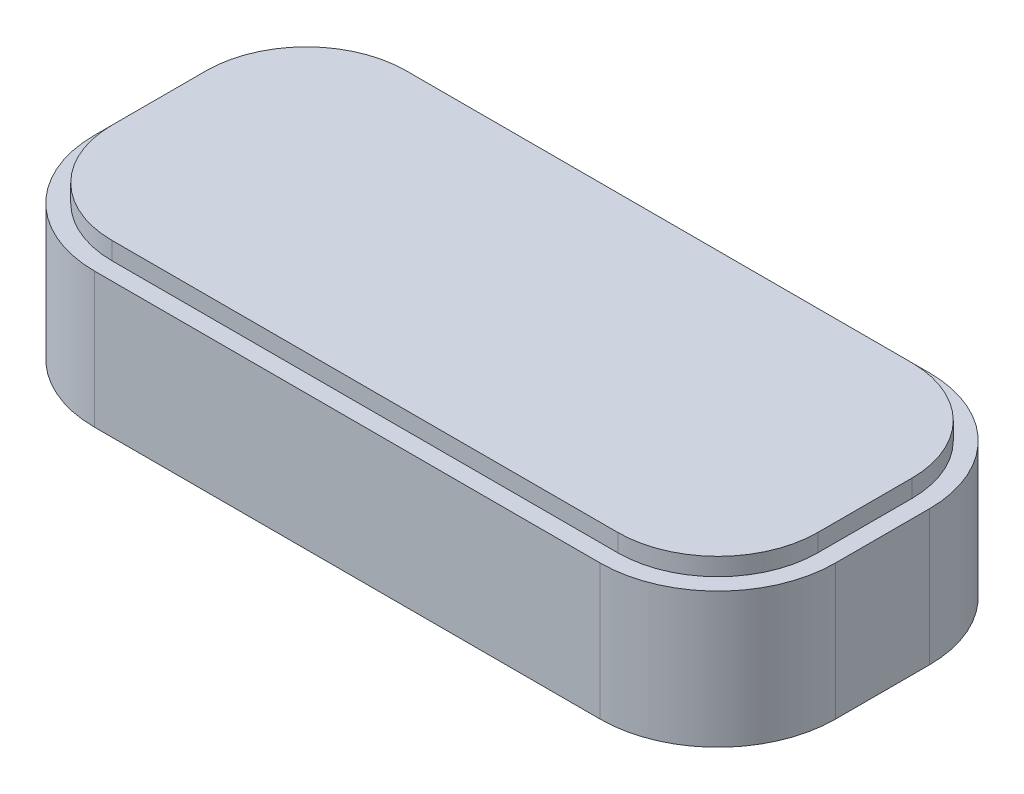
ISO-10303-21;
HEADER;
FILE_DESCRIPTION(('STEP AP214'),'2;1');
FILE_NAME('part.step','',(''),(''),'','','');
FILE_SCHEMA(('AUTOMOTIVE_DESIGN { 1 0 10303 214 1 1 1 1 }'));
ENDSEC;
DATA;
#1=APPLICATION_CONTEXT('core data for automotive mechanical design processes');
#2=APPLICATION_PROTOCOL_DEFINITION('international standard','automotive_design',2000,#1);
#3=PRODUCT_CONTEXT('',#1,'mechanical');
#4=PRODUCT('Part','Part','',(#3));
#5=PRODUCT_RELATED_PRODUCT_CATEGORY('part','',(#4));
#6=PRODUCT_DEFINITION_FORMATION('','',#4);
#7=PRODUCT_DEFINITION_CONTEXT('part definition',#1,'design');
#8=PRODUCT_DEFINITION('design','',#6,#7);
#9=PRODUCT_DEFINITION_SHAPE('','',#8);
#10=(LENGTH_UNIT() NAMED_UNIT(*) SI_UNIT(.MILLI.,.METRE.));
#11=(NAMED_UNIT(*) PLANE_ANGLE_UNIT() SI_UNIT($,.RADIAN.));
#12=(NAMED_UNIT(*) SI_UNIT($,.STERADIAN.) SOLID_ANGLE_UNIT());
#13=UNCERTAINTY_MEASURE_WITH_UNIT(LENGTH_MEASURE(1.E-05),#10,'distance_accuracy_value','');
#14=(GEOMETRIC_REPRESENTATION_CONTEXT(3) GLOBAL_UNCERTAINTY_ASSIGNED_CONTEXT((#13)) GLOBAL_UNIT_ASSIGNED_CONTEXT((#10,
#11,#12)) REPRESENTATION_CONTEXT('',''));
#15=CARTESIAN_POINT('',(0.,0.,0.));
#16=DIRECTION('',(0.,0.,1.));
#17=DIRECTION('',(1.,0.,0.));
#18=AXIS2_PLACEMENT_3D('',#15,#16,#17);
#19=CARTESIAN_POINT('',(-1.0922,0.5842,-0.2032));
#20=DIRECTION('',(0.,-1.,0.));
#21=DIRECTION('',(0.,0.,-1.));
#22=AXIS2_PLACEMENT_3D('',#19,#20,#21);
#23=PLANE('',#22);
#24=CARTESIAN_POINT('',(-1.0922,0.5842,-0.2032));
#25=DIRECTION('',(0.,1.,0.));
#26=DIRECTION('',(0.,0.,-1.));
#27=AXIS2_PLACEMENT_3D('',#24,#25,#26);
#28=CIRCLE('',#27,0.508);
#29=CARTESIAN_POINT('',(-1.0922,0.5842,-0.7112));
#30=VERTEX_POINT('',#29);
#31=CARTESIAN_POINT('',(-1.6002,0.5842,-0.2032));
#32=VERTEX_POINT('',#31);
#33=EDGE_CURVE('E175',#30,#32,#28,.T.);
#34=ORIENTED_EDGE('',*,*,#33,.T.);
#35=DIRECTION('',(0.,0.,1.));
#36=VECTOR('',#35,1.);
#37=CARTESIAN_POINT('',(-1.6002,0.5842,-0.2032));
#38=LINE('',#37,#36);
#39=CARTESIAN_POINT('',(-1.6002,0.5842,0.2032));
#40=VERTEX_POINT('',#39);
#41=EDGE_CURVE('E178',#32,#40,#38,.T.);
#42=ORIENTED_EDGE('',*,*,#41,.T.);
#43=CARTESIAN_POINT('',(-1.0922,0.5842,0.2032));
#44=DIRECTION('',(0.,1.,0.));
#45=DIRECTION('',(0.,0.,1.));
#46=AXIS2_PLACEMENT_3D('',#43,#44,#45);
#47=CIRCLE('',#46,0.508);
#48=CARTESIAN_POINT('',(-1.0922,0.5842,0.7112));
#49=VERTEX_POINT('',#48);
#50=EDGE_CURVE('E181',#40,#49,#47,.T.);
#51=ORIENTED_EDGE('',*,*,#50,.T.);
#52=DIRECTION('',(1.,0.,0.));
#53=VECTOR('',#52,1.);
#54=CARTESIAN_POINT('',(-1.0922,0.5842,0.7112));
#55=LINE('',#54,#53);
#56=CARTESIAN_POINT('',(1.0922,0.5842,0.7112));
#57=VERTEX_POINT('',#56);
#58=EDGE_CURVE('E183',#49,#57,#55,.T.);
#59=ORIENTED_EDGE('',*,*,#58,.T.);
#60=CARTESIAN_POINT('',(1.0922,0.5842,0.2032));
#61=DIRECTION('',(0.,1.,0.));
#62=DIRECTION('',(0.,0.,1.));
#63=AXIS2_PLACEMENT_3D('',#60,#61,#62);
#64=CIRCLE('',#63,0.508);
#65=CARTESIAN_POINT('',(1.6002,0.5842,0.2032));
#66=VERTEX_POINT('',#65);
#67=EDGE_CURVE('E185',#57,#66,#64,.T.);
#68=ORIENTED_EDGE('',*,*,#67,.T.);
#69=DIRECTION('',(0.,0.,-1.));
#70=VECTOR('',#69,1.);
#71=CARTESIAN_POINT('',(1.6002,0.5842,0.2032));
#72=LINE('',#71,#70);
#73=CARTESIAN_POINT('',(1.6002,0.5842,-0.2032));
#74=VERTEX_POINT('',#73);
#75=EDGE_CURVE('E187',#66,#74,#72,.T.);
#76=ORIENTED_EDGE('',*,*,#75,.T.);
#77=CARTESIAN_POINT('',(1.0922,0.5842,-0.2032));
#78=DIRECTION('',(0.,1.,0.));
#79=DIRECTION('',(0.,0.,1.));
#80=AXIS2_PLACEMENT_3D('',#77,#78,#79);
#81=CIRCLE('',#80,0.508);
#82=CARTESIAN_POINT('',(1.0922,0.5842,-0.7112));
#83=VERTEX_POINT('',#82);
#84=EDGE_CURVE('E189',#74,#83,#81,.T.);
#85=ORIENTED_EDGE('',*,*,#84,.T.);
#86=DIRECTION('',(-1.,0.,0.));
#87=VECTOR('',#86,1.);
#88=CARTESIAN_POINT('',(-1.0922,0.5842,-0.7112));
#89=LINE('',#88,#87);
#90=EDGE_CURVE('E191',#83,#30,#89,.T.);
#91=ORIENTED_EDGE('',*,*,#90,.T.);
#92=EDGE_LOOP('',(#34,#42,#51,#59,#68,#76,#85,#91));
#93=FACE_BOUND('',#92,.T.);
#94=CARTESIAN_POINT('',(-1.0922,0.5842,-0.2032));
#95=DIRECTION('',(0.,1.,0.));
#96=DIRECTION('',(0.,0.,-1.));
#97=AXIS2_PLACEMENT_3D('',#94,#95,#96);
#98=CIRCLE('',#97,0.4318);
#99=CARTESIAN_POINT('',(-1.0922,0.5842,-0.635));
#100=VERTEX_POINT('',#99);
#101=CARTESIAN_POINT('',(-1.524,0.5842,-0.2032));
#102=VERTEX_POINT('',#101);
#103=EDGE_CURVE('E165',#100,#102,#98,.T.);
#104=ORIENTED_EDGE('',*,*,#103,.F.);
#105=DIRECTION('',(-1.,0.,0.));
#106=VECTOR('',#105,1.);
#107=CARTESIAN_POINT('',(1.0922,0.5842,-0.635));
#108=LINE('',#107,#106);
#109=CARTESIAN_POINT('',(1.0922,0.5842,-0.635));
#110=VERTEX_POINT('',#109);
#111=EDGE_CURVE('E162',#110,#100,#108,.T.);
#112=ORIENTED_EDGE('',*,*,#111,.F.);
#113=CARTESIAN_POINT('',(1.0922,0.5842,-0.2032));
#114=DIRECTION('',(0.,1.,0.));
#115=DIRECTION('',(0.,0.,1.));
#116=AXIS2_PLACEMENT_3D('',#113,#114,#115);
#117=CIRCLE('',#116,0.4318);
#118=CARTESIAN_POINT('',(1.524,0.5842,-0.2032));
#119=VERTEX_POINT('',#118);
#120=EDGE_CURVE('E431',#119,#110,#117,.T.);
#121=ORIENTED_EDGE('',*,*,#120,.F.);
#122=DIRECTION('',(0.,0.,-1.));
#123=VECTOR('',#122,1.);
#124=CARTESIAN_POINT('',(1.524,0.5842,0.2032));
#125=LINE('',#124,#123);
#126=CARTESIAN_POINT('',(1.524,0.5842,0.2032));
#127=VERTEX_POINT('',#126);
#128=EDGE_CURVE('E462',#127,#119,#125,.T.);
#129=ORIENTED_EDGE('',*,*,#128,.F.);
#130=CARTESIAN_POINT('',(1.0922,0.5842,0.2032));
#131=DIRECTION('',(0.,1.,0.));
#132=DIRECTION('',(0.,0.,1.));
#133=AXIS2_PLACEMENT_3D('',#130,#131,#132);
#134=CIRCLE('',#133,0.4318);
#135=CARTESIAN_POINT('',(1.0922,0.5842,0.635));
#136=VERTEX_POINT('',#135);
#137=EDGE_CURVE('E455',#136,#127,#134,.T.);
#138=ORIENTED_EDGE('',*,*,#137,.F.);
#139=DIRECTION('',(1.,0.,0.));
#140=VECTOR('',#139,1.);
#141=CARTESIAN_POINT('',(-1.0922,0.5842,0.635));
#142=LINE('',#141,#140);
#143=CARTESIAN_POINT('',(-1.0922,0.5842,0.635));
#144=VERTEX_POINT('',#143);
#145=EDGE_CURVE('E452',#144,#136,#142,.T.);
#146=ORIENTED_EDGE('',*,*,#145,.F.);
#147=CARTESIAN_POINT('',(-1.0922,0.5842,0.2032));
#148=DIRECTION('',(0.,1.,0.));
#149=DIRECTION('',(0.,0.,1.));
#150=AXIS2_PLACEMENT_3D('',#147,#148,#149);
#151=CIRCLE('',#150,0.4318);
#152=CARTESIAN_POINT('',(-1.524,0.5842,0.2032));
#153=VERTEX_POINT('',#152);
#154=EDGE_CURVE('E52',#153,#144,#151,.T.);
#155=ORIENTED_EDGE('',*,*,#154,.F.);
#156=DIRECTION('',(0.,0.,1.));
#157=VECTOR('',#156,1.);
#158=CARTESIAN_POINT('',(-1.524,0.5842,-0.2032));
#159=LINE('',#158,#157);
#160=EDGE_CURVE('E47',#102,#153,#159,.T.);
#161=ORIENTED_EDGE('',*,*,#160,.F.);
#162=EDGE_LOOP('',(#104,#112,#121,#129,#138,#146,#155,#161));
#163=FACE_BOUND('',#162,.T.);
#164=ADVANCED_FACE('F32',(#93,#163),#23,.F.);
#165=CARTESIAN_POINT('',(-1.0922,0.5842,-0.2032));
#166=DIRECTION('',(0.,-1.,0.));
#167=DIRECTION('',(0.,0.,-1.));
#168=AXIS2_PLACEMENT_3D('',#165,#166,#167);
#169=CYLINDRICAL_SURFACE('',#168,0.508);
#170=CARTESIAN_POINT('',(-1.0922,0.,-0.2032));
#171=DIRECTION('',(0.,1.,0.));
#172=DIRECTION('',(0.,0.,-1.));
#173=AXIS2_PLACEMENT_3D('',#170,#171,#172);
#174=CIRCLE('',#173,0.508);
#175=CARTESIAN_POINT('',(-1.0922,0.,-0.7112));
#176=VERTEX_POINT('',#175);
#177=CARTESIAN_POINT('',(-1.6002,0.,-0.2032));
#178=VERTEX_POINT('',#177);
#179=EDGE_CURVE('E166',#176,#178,#174,.T.);
#180=ORIENTED_EDGE('',*,*,#179,.T.);
#181=DIRECTION('',(0.,-1.,0.));
#182=VECTOR('',#181,1.);
#183=CARTESIAN_POINT('',(-1.6002,0.5842,-0.2032));
#184=LINE('',#183,#182);
#185=EDGE_CURVE('E11',#32,#178,#184,.T.);
#186=ORIENTED_EDGE('',*,*,#185,.F.);
#187=ORIENTED_EDGE('',*,*,#33,.F.);
#188=DIRECTION('',(0.,-1.,0.));
#189=VECTOR('',#188,1.);
#190=CARTESIAN_POINT('',(-1.0922,0.5842,-0.7112));
#191=LINE('',#190,#189);
#192=EDGE_CURVE('E192',#30,#176,#191,.T.);
#193=ORIENTED_EDGE('',*,*,#192,.T.);
#194=EDGE_LOOP('',(#180,#186,#187,#193));
#195=FACE_BOUND('',#194,.T.);
#196=ADVANCED_FACE('F34',(#195),#169,.T.);
#197=CARTESIAN_POINT('',(-1.6002,0.5842,-0.2032));
#198=DIRECTION('',(1.,0.,0.));
#199=DIRECTION('',(0.,0.,-1.));
#200=AXIS2_PLACEMENT_3D('',#197,#198,#199);
#201=PLANE('',#200);
#202=DIRECTION('',(0.,0.,1.));
#203=VECTOR('',#202,1.);
#204=CARTESIAN_POINT('',(-1.6002,0.,-0.2032));
#205=LINE('',#204,#203);
#206=CARTESIAN_POINT('',(-1.6002,0.,0.2032));
#207=VERTEX_POINT('',#206);
#208=EDGE_CURVE('E169',#178,#207,#205,.T.);
#209=ORIENTED_EDGE('',*,*,#208,.T.);
#210=DIRECTION('',(0.,-1.,0.));
#211=VECTOR('',#210,1.);
#212=CARTESIAN_POINT('',(-1.6002,0.5842,0.2032));
#213=LINE('',#212,#211);
#214=EDGE_CURVE('E40',#40,#207,#213,.T.);
#215=ORIENTED_EDGE('',*,*,#214,.F.);
#216=ORIENTED_EDGE('',*,*,#41,.F.);
#217=ORIENTED_EDGE('',*,*,#185,.T.);
#218=EDGE_LOOP('',(#209,#215,#216,#217));
#219=FACE_BOUND('',#218,.T.);
#220=ADVANCED_FACE('F249',(#219),#201,.F.);
#221=CARTESIAN_POINT('',(-1.0922,0.5842,0.2032));
#222=DIRECTION('',(0.,-1.,0.));
#223=DIRECTION('',(0.,0.,-1.));
#224=AXIS2_PLACEMENT_3D('',#221,#222,#223);
#225=CYLINDRICAL_SURFACE('',#224,0.508);
#226=CARTESIAN_POINT('',(-1.0922,0.,0.2032));
#227=DIRECTION('',(0.,1.,0.));
#228=DIRECTION('',(0.,0.,1.));
#229=AXIS2_PLACEMENT_3D('',#226,#227,#228);
#230=CIRCLE('',#229,0.508);
#231=CARTESIAN_POINT('',(-1.0922,0.,0.7112));
#232=VERTEX_POINT('',#231);
#233=EDGE_CURVE('E195',#207,#232,#230,.T.);
#234=ORIENTED_EDGE('',*,*,#233,.T.);
#235=DIRECTION('',(0.,-1.,0.));
#236=VECTOR('',#235,1.);
#237=CARTESIAN_POINT('',(-1.0922,0.5842,0.7112));
#238=LINE('',#237,#236);
#239=EDGE_CURVE('E220',#49,#232,#238,.T.);
#240=ORIENTED_EDGE('',*,*,#239,.F.);
#241=ORIENTED_EDGE('',*,*,#50,.F.);
#242=ORIENTED_EDGE('',*,*,#214,.T.);
#243=EDGE_LOOP('',(#234,#240,#241,#242));
#244=FACE_BOUND('',#243,.T.);
#245=ADVANCED_FACE('F227',(#244),#225,.T.);
#246=CARTESIAN_POINT('',(-1.0922,0.5842,0.7112));
#247=DIRECTION('',(0.,0.,-1.));
#248=DIRECTION('',(-1.,0.,0.));
#249=AXIS2_PLACEMENT_3D('',#246,#247,#248);
#250=PLANE('',#249);
#251=DIRECTION('',(1.,0.,0.));
#252=VECTOR('',#251,1.);
#253=CARTESIAN_POINT('',(-1.0922,0.,0.7112));
#254=LINE('',#253,#252);
#255=CARTESIAN_POINT('',(1.0922,0.,0.7112));
#256=VERTEX_POINT('',#255);
#257=EDGE_CURVE('E197',#232,#256,#254,.T.);
#258=ORIENTED_EDGE('',*,*,#257,.T.);
#259=DIRECTION('',(0.,-1.,0.));
#260=VECTOR('',#259,1.);
#261=CARTESIAN_POINT('',(1.0922,0.5842,0.7112));
#262=LINE('',#261,#260);
#263=EDGE_CURVE('E217',#57,#256,#262,.T.);
#264=ORIENTED_EDGE('',*,*,#263,.F.);
#265=ORIENTED_EDGE('',*,*,#58,.F.);
#266=ORIENTED_EDGE('',*,*,#239,.T.);
#267=EDGE_LOOP('',(#258,#264,#265,#266));
#268=FACE_BOUND('',#267,.T.);
#269=ADVANCED_FACE('F238',(#268),#250,.F.);
#270=CARTESIAN_POINT('',(1.0922,0.5842,0.2032));
#271=DIRECTION('',(0.,-1.,0.));
#272=DIRECTION('',(0.,0.,-1.));
#273=AXIS2_PLACEMENT_3D('',#270,#271,#272);
#274=CYLINDRICAL_SURFACE('',#273,0.508);
#275=CARTESIAN_POINT('',(1.0922,0.,0.2032));
#276=DIRECTION('',(0.,1.,0.));
#277=DIRECTION('',(0.,0.,1.));
#278=AXIS2_PLACEMENT_3D('',#275,#276,#277);
#279=CIRCLE('',#278,0.508);
#280=CARTESIAN_POINT('',(1.6002,0.,0.2032));
#281=VERTEX_POINT('',#280);
#282=EDGE_CURVE('E199',#256,#281,#279,.T.);
#283=ORIENTED_EDGE('',*,*,#282,.T.);
#284=DIRECTION('',(0.,-1.,0.));
#285=VECTOR('',#284,1.);
#286=CARTESIAN_POINT('',(1.6002,0.5842,0.2032));
#287=LINE('',#286,#285);
#288=EDGE_CURVE('E214',#66,#281,#287,.T.);
#289=ORIENTED_EDGE('',*,*,#288,.F.);
#290=ORIENTED_EDGE('',*,*,#67,.F.);
#291=ORIENTED_EDGE('',*,*,#263,.T.);
#292=EDGE_LOOP('',(#283,#289,#290,#291));
#293=FACE_BOUND('',#292,.T.);
#294=ADVANCED_FACE('F242',(#293),#274,.T.);
#295=CARTESIAN_POINT('',(1.6002,0.5842,0.2032));
#296=DIRECTION('',(-1.,0.,0.));
#297=DIRECTION('',(0.,0.,1.));
#298=AXIS2_PLACEMENT_3D('',#295,#296,#297);
#299=PLANE('',#298);
#300=DIRECTION('',(0.,0.,-1.));
#301=VECTOR('',#300,1.);
#302=CARTESIAN_POINT('',(1.6002,0.,0.2032));
#303=LINE('',#302,#301);
#304=CARTESIAN_POINT('',(1.6002,0.,-0.2032));
#305=VERTEX_POINT('',#304);
#306=EDGE_CURVE('E201',#281,#305,#303,.T.);
#307=ORIENTED_EDGE('',*,*,#306,.T.);
#308=DIRECTION('',(0.,-1.,0.));
#309=VECTOR('',#308,1.);
#310=CARTESIAN_POINT('',(1.6002,0.5842,-0.2032));
#311=LINE('',#310,#309);
#312=EDGE_CURVE('E211',#74,#305,#311,.T.);
#313=ORIENTED_EDGE('',*,*,#312,.F.);
#314=ORIENTED_EDGE('',*,*,#75,.F.);
#315=ORIENTED_EDGE('',*,*,#288,.T.);
#316=EDGE_LOOP('',(#307,#313,#314,#315));
#317=FACE_BOUND('',#316,.T.);
#318=ADVANCED_FACE('F262',(#317),#299,.F.);
#319=CARTESIAN_POINT('',(1.0922,0.5842,-0.2032));
#320=DIRECTION('',(0.,-1.,0.));
#321=DIRECTION('',(0.,0.,-1.));
#322=AXIS2_PLACEMENT_3D('',#319,#320,#321);
#323=CYLINDRICAL_SURFACE('',#322,0.508);
#324=CARTESIAN_POINT('',(1.0922,0.,-0.2032));
#325=DIRECTION('',(0.,1.,0.));
#326=DIRECTION('',(0.,0.,1.));
#327=AXIS2_PLACEMENT_3D('',#324,#325,#326);
#328=CIRCLE('',#327,0.508);
#329=CARTESIAN_POINT('',(1.0922,0.,-0.7112));
#330=VERTEX_POINT('',#329);
#331=EDGE_CURVE('E203',#305,#330,#328,.T.);
#332=ORIENTED_EDGE('',*,*,#331,.T.);
#333=DIRECTION('',(0.,-1.,0.));
#334=VECTOR('',#333,1.);
#335=CARTESIAN_POINT('',(1.0922,0.5842,-0.7112));
#336=LINE('',#335,#334);
#337=EDGE_CURVE('E208',#83,#330,#336,.T.);
#338=ORIENTED_EDGE('',*,*,#337,.F.);
#339=ORIENTED_EDGE('',*,*,#84,.F.);
#340=ORIENTED_EDGE('',*,*,#312,.T.);
#341=EDGE_LOOP('',(#332,#338,#339,#340));
#342=FACE_BOUND('',#341,.T.);
#343=ADVANCED_FACE('F260',(#342),#323,.T.);
#344=CARTESIAN_POINT('',(-1.0922,0.5842,-0.7112));
#345=DIRECTION('',(0.,0.,1.));
#346=DIRECTION('',(1.,0.,0.));
#347=AXIS2_PLACEMENT_3D('',#344,#345,#346);
#348=PLANE('',#347);
#349=DIRECTION('',(-1.,0.,0.));
#350=VECTOR('',#349,1.);
#351=CARTESIAN_POINT('',(-1.0922,0.,-0.7112));
#352=LINE('',#351,#350);
#353=EDGE_CURVE('E179',#330,#176,#352,.T.);
#354=ORIENTED_EDGE('',*,*,#353,.T.);
#355=ORIENTED_EDGE('',*,*,#192,.F.);
#356=ORIENTED_EDGE('',*,*,#90,.F.);
#357=ORIENTED_EDGE('',*,*,#337,.T.);
#358=EDGE_LOOP('',(#354,#355,#356,#357));
#359=FACE_BOUND('',#358,.T.);
#360=ADVANCED_FACE('F255',(#359),#348,.F.);
#361=CARTESIAN_POINT('',(-1.0922,0.,-0.2032));
#362=DIRECTION('',(0.,-1.,0.));
#363=DIRECTION('',(0.,0.,-1.));
#364=AXIS2_PLACEMENT_3D('',#361,#362,#363);
#365=PLANE('',#364);
#366=ORIENTED_EDGE('',*,*,#179,.F.);
#367=ORIENTED_EDGE('',*,*,#353,.F.);
#368=ORIENTED_EDGE('',*,*,#331,.F.);
#369=ORIENTED_EDGE('',*,*,#306,.F.);
#370=ORIENTED_EDGE('',*,*,#282,.F.);
#371=ORIENTED_EDGE('',*,*,#257,.F.);
#372=ORIENTED_EDGE('',*,*,#233,.F.);
#373=ORIENTED_EDGE('',*,*,#208,.F.);
#374=EDGE_LOOP('',(#366,#367,#368,#369,#370,#371,#372,#373));
#375=FACE_BOUND('',#374,.T.);
#376=ADVANCED_FACE('F233',(#375),#365,.T.);
#377=CARTESIAN_POINT('',(-1.0922,0.6604,-0.2032));
#378=DIRECTION('',(0.,-1.,0.));
#379=DIRECTION('',(0.,0.,-1.));
#380=AXIS2_PLACEMENT_3D('',#377,#378,#379);
#381=CYLINDRICAL_SURFACE('',#380,0.4318);
#382=ORIENTED_EDGE('',*,*,#103,.T.);
#383=DIRECTION('',(0.,-1.,0.));
#384=VECTOR('',#383,1.);
#385=CARTESIAN_POINT('',(-1.524,0.6604,-0.2032));
#386=LINE('',#385,#384);
#387=CARTESIAN_POINT('',(-1.524,0.6604,-0.2032));
#388=VERTEX_POINT('',#387);
#389=EDGE_CURVE('E146',#388,#102,#386,.T.);
#390=ORIENTED_EDGE('',*,*,#389,.F.);
#391=CARTESIAN_POINT('',(-1.0922,0.6604,-0.2032));
#392=DIRECTION('',(0.,1.,0.));
#393=DIRECTION('',(0.,0.,-1.));
#394=AXIS2_PLACEMENT_3D('',#391,#392,#393);
#395=CIRCLE('',#394,0.4318);
#396=CARTESIAN_POINT('',(-1.0922,0.6604,-0.635));
#397=VERTEX_POINT('',#396);
#398=EDGE_CURVE('E153',#397,#388,#395,.T.);
#399=ORIENTED_EDGE('',*,*,#398,.F.);
#400=DIRECTION('',(0.,-1.,0.));
#401=VECTOR('',#400,1.);
#402=CARTESIAN_POINT('',(-1.0922,0.6604,-0.635));
#403=LINE('',#402,#401);
#404=EDGE_CURVE('E427',#397,#100,#403,.T.);
#405=ORIENTED_EDGE('',*,*,#404,.T.);
#406=EDGE_LOOP('',(#382,#390,#399,#405));
#407=FACE_BOUND('',#406,.T.);
#408=ADVANCED_FACE('F164',(#407),#381,.T.);
#409=CARTESIAN_POINT('',(-1.524,0.6604,-0.2032));
#410=DIRECTION('',(1.,0.,0.));
#411=DIRECTION('',(0.,0.,-1.));
#412=AXIS2_PLACEMENT_3D('',#409,#410,#411);
#413=PLANE('',#412);
#414=ORIENTED_EDGE('',*,*,#160,.T.);
#415=DIRECTION('',(0.,-1.,0.));
#416=VECTOR('',#415,1.);
#417=CARTESIAN_POINT('',(-1.524,0.6604,0.2032));
#418=LINE('',#417,#416);
#419=CARTESIAN_POINT('',(-1.524,0.6604,0.2032));
#420=VERTEX_POINT('',#419);
#421=EDGE_CURVE('E149',#420,#153,#418,.T.);
#422=ORIENTED_EDGE('',*,*,#421,.F.);
#423=DIRECTION('',(0.,0.,1.));
#424=VECTOR('',#423,1.);
#425=CARTESIAN_POINT('',(-1.524,0.6604,-0.2032));
#426=LINE('',#425,#424);
#427=EDGE_CURVE('E142',#388,#420,#426,.T.);
#428=ORIENTED_EDGE('',*,*,#427,.F.);
#429=ORIENTED_EDGE('',*,*,#389,.T.);
#430=EDGE_LOOP('',(#414,#422,#428,#429));
#431=FACE_BOUND('',#430,.T.);
#432=ADVANCED_FACE('F144',(#431),#413,.F.);
#433=CARTESIAN_POINT('',(-1.0922,0.6604,0.2032));
#434=DIRECTION('',(0.,-1.,0.));
#435=DIRECTION('',(0.,0.,-1.));
#436=AXIS2_PLACEMENT_3D('',#433,#434,#435);
#437=CYLINDRICAL_SURFACE('',#436,0.4318);
#438=ORIENTED_EDGE('',*,*,#154,.T.);
#439=DIRECTION('',(0.,-1.,0.));
#440=VECTOR('',#439,1.);
#441=CARTESIAN_POINT('',(-1.0922,0.6604,0.635));
#442=LINE('',#441,#440);
#443=CARTESIAN_POINT('',(-1.0922,0.6604,0.635));
#444=VERTEX_POINT('',#443);
#445=EDGE_CURVE('E171',#444,#144,#442,.T.);
#446=ORIENTED_EDGE('',*,*,#445,.F.);
#447=CARTESIAN_POINT('',(-1.0922,0.6604,0.2032));
#448=DIRECTION('',(0.,1.,0.));
#449=DIRECTION('',(0.,0.,1.));
#450=AXIS2_PLACEMENT_3D('',#447,#448,#449);
#451=CIRCLE('',#450,0.4318);
#452=EDGE_CURVE('E152',#420,#444,#451,.T.);
#453=ORIENTED_EDGE('',*,*,#452,.F.);
#454=ORIENTED_EDGE('',*,*,#421,.T.);
#455=EDGE_LOOP('',(#438,#446,#453,#454));
#456=FACE_BOUND('',#455,.T.);
#457=ADVANCED_FACE('F301',(#456),#437,.T.);
#458=CARTESIAN_POINT('',(-1.0922,0.6604,0.635));
#459=DIRECTION('',(0.,0.,-1.));
#460=DIRECTION('',(-1.,0.,0.));
#461=AXIS2_PLACEMENT_3D('',#458,#459,#460);
#462=PLANE('',#461);
#463=ORIENTED_EDGE('',*,*,#145,.T.);
#464=DIRECTION('',(0.,-1.,0.));
#465=VECTOR('',#464,1.);
#466=CARTESIAN_POINT('',(1.0922,0.6604,0.635));
#467=LINE('',#466,#465);
#468=CARTESIAN_POINT('',(1.0922,0.6604,0.635));
#469=VERTEX_POINT('',#468);
#470=EDGE_CURVE('E445',#469,#136,#467,.T.);
#471=ORIENTED_EDGE('',*,*,#470,.F.);
#472=DIRECTION('',(1.,0.,0.));
#473=VECTOR('',#472,1.);
#474=CARTESIAN_POINT('',(-1.0922,0.6604,0.635));
#475=LINE('',#474,#473);
#476=EDGE_CURVE('E453',#444,#469,#475,.T.);
#477=ORIENTED_EDGE('',*,*,#476,.F.);
#478=ORIENTED_EDGE('',*,*,#445,.T.);
#479=EDGE_LOOP('',(#463,#471,#477,#478));
#480=FACE_BOUND('',#479,.T.);
#481=ADVANCED_FACE('F307',(#480),#462,.F.);
#482=CARTESIAN_POINT('',(1.0922,0.6604,0.2032));
#483=DIRECTION('',(0.,-1.,0.));
#484=DIRECTION('',(0.,0.,-1.));
#485=AXIS2_PLACEMENT_3D('',#482,#483,#484);
#486=CYLINDRICAL_SURFACE('',#485,0.4318);
#487=ORIENTED_EDGE('',*,*,#137,.T.);
#488=DIRECTION('',(0.,-1.,0.));
#489=VECTOR('',#488,1.);
#490=CARTESIAN_POINT('',(1.524,0.6604,0.2032));
#491=LINE('',#490,#489);
#492=CARTESIAN_POINT('',(1.524,0.6604,0.2032));
#493=VERTEX_POINT('',#492);
#494=EDGE_CURVE('E442',#493,#127,#491,.T.);
#495=ORIENTED_EDGE('',*,*,#494,.F.);
#496=CARTESIAN_POINT('',(1.0922,0.6604,0.2032));
#497=DIRECTION('',(0.,1.,0.));
#498=DIRECTION('',(0.,0.,1.));
#499=AXIS2_PLACEMENT_3D('',#496,#497,#498);
#500=CIRCLE('',#499,0.4318);
#501=EDGE_CURVE('E470',#469,#493,#500,.T.);
#502=ORIENTED_EDGE('',*,*,#501,.F.);
#503=ORIENTED_EDGE('',*,*,#470,.T.);
#504=EDGE_LOOP('',(#487,#495,#502,#503));
#505=FACE_BOUND('',#504,.T.);
#506=ADVANCED_FACE('F315',(#505),#486,.T.);
#507=CARTESIAN_POINT('',(1.524,0.6604,0.2032));
#508=DIRECTION('',(-1.,0.,0.));
#509=DIRECTION('',(0.,0.,1.));
#510=AXIS2_PLACEMENT_3D('',#507,#508,#509);
#511=PLANE('',#510);
#512=ORIENTED_EDGE('',*,*,#128,.T.);
#513=DIRECTION('',(0.,-1.,0.));
#514=VECTOR('',#513,1.);
#515=CARTESIAN_POINT('',(1.524,0.6604,-0.2032));
#516=LINE('',#515,#514);
#517=CARTESIAN_POINT('',(1.524,0.6604,-0.2032));
#518=VERTEX_POINT('',#517);
#519=EDGE_CURVE('E434',#518,#119,#516,.T.);
#520=ORIENTED_EDGE('',*,*,#519,.F.);
#521=DIRECTION('',(0.,0.,-1.));
#522=VECTOR('',#521,1.);
#523=CARTESIAN_POINT('',(1.524,0.6604,0.2032));
#524=LINE('',#523,#522);
#525=EDGE_CURVE('E468',#493,#518,#524,.T.);
#526=ORIENTED_EDGE('',*,*,#525,.F.);
#527=ORIENTED_EDGE('',*,*,#494,.T.);
#528=EDGE_LOOP('',(#512,#520,#526,#527));
#529=FACE_BOUND('',#528,.T.);
#530=ADVANCED_FACE('F323',(#529),#511,.F.);
#531=CARTESIAN_POINT('',(1.0922,0.6604,-0.2032));
#532=DIRECTION('',(0.,-1.,0.));
#533=DIRECTION('',(0.,0.,-1.));
#534=AXIS2_PLACEMENT_3D('',#531,#532,#533);
#535=CYLINDRICAL_SURFACE('',#534,0.4318);
#536=ORIENTED_EDGE('',*,*,#120,.T.);
#537=DIRECTION('',(0.,-1.,0.));
#538=VECTOR('',#537,1.);
#539=CARTESIAN_POINT('',(1.0922,0.6604,-0.635));
#540=LINE('',#539,#538);
#541=CARTESIAN_POINT('',(1.0922,0.6604,-0.635));
#542=VERTEX_POINT('',#541);
#543=EDGE_CURVE('E429',#542,#110,#540,.T.);
#544=ORIENTED_EDGE('',*,*,#543,.F.);
#545=CARTESIAN_POINT('',(1.0922,0.6604,-0.2032));
#546=DIRECTION('',(0.,1.,0.));
#547=DIRECTION('',(0.,0.,1.));
#548=AXIS2_PLACEMENT_3D('',#545,#546,#547);
#549=CIRCLE('',#548,0.4318);
#550=EDGE_CURVE('E436',#518,#542,#549,.T.);
#551=ORIENTED_EDGE('',*,*,#550,.F.);
#552=ORIENTED_EDGE('',*,*,#519,.T.);
#553=EDGE_LOOP('',(#536,#544,#551,#552));
#554=FACE_BOUND('',#553,.T.);
#555=ADVANCED_FACE('F331',(#554),#535,.T.);
#556=CARTESIAN_POINT('',(1.0922,0.6604,-0.635));
#557=DIRECTION('',(0.,0.,1.));
#558=DIRECTION('',(1.,0.,0.));
#559=AXIS2_PLACEMENT_3D('',#556,#557,#558);
#560=PLANE('',#559);
#561=ORIENTED_EDGE('',*,*,#111,.T.);
#562=ORIENTED_EDGE('',*,*,#404,.F.);
#563=DIRECTION('',(-1.,0.,0.));
#564=VECTOR('',#563,1.);
#565=CARTESIAN_POINT('',(1.0922,0.6604,-0.635));
#566=LINE('',#565,#564);
#567=EDGE_CURVE('E158',#542,#397,#566,.T.);
#568=ORIENTED_EDGE('',*,*,#567,.F.);
#569=ORIENTED_EDGE('',*,*,#543,.T.);
#570=EDGE_LOOP('',(#561,#562,#568,#569));
#571=FACE_BOUND('',#570,.T.);
#572=ADVANCED_FACE('F339',(#571),#560,.F.);
#573=CARTESIAN_POINT('',(-1.0922,0.6604,-0.2032));
#574=DIRECTION('',(0.,-1.,0.));
#575=DIRECTION('',(0.,0.,-1.));
#576=AXIS2_PLACEMENT_3D('',#573,#574,#575);
#577=PLANE('',#576);
#578=ORIENTED_EDGE('',*,*,#398,.T.);
#579=ORIENTED_EDGE('',*,*,#427,.T.);
#580=ORIENTED_EDGE('',*,*,#452,.T.);
#581=ORIENTED_EDGE('',*,*,#476,.T.);
#582=ORIENTED_EDGE('',*,*,#501,.T.);
#583=ORIENTED_EDGE('',*,*,#525,.T.);
#584=ORIENTED_EDGE('',*,*,#550,.T.);
#585=ORIENTED_EDGE('',*,*,#567,.T.);
#586=EDGE_LOOP('',(#578,#579,#580,#581,#582,#583,#584,#585));
#587=FACE_BOUND('',#586,.T.);
#588=ADVANCED_FACE('F156',(#587),#577,.F.);
#589=CLOSED_SHELL('',(#164,#196,#220,#245,#269,#294,#318,#343,#360,#376,#408,#432,#457,#481,
#506,#530,#555,#572,#588));
#590=MANIFOLD_SOLID_BREP('B2',#589);
#591=ADVANCED_BREP_SHAPE_REPRESENTATION('',(#18,#590),#14);
#592=SHAPE_DEFINITION_REPRESENTATION(#9,#591);
ENDSEC;
END-ISO-10303-21;
